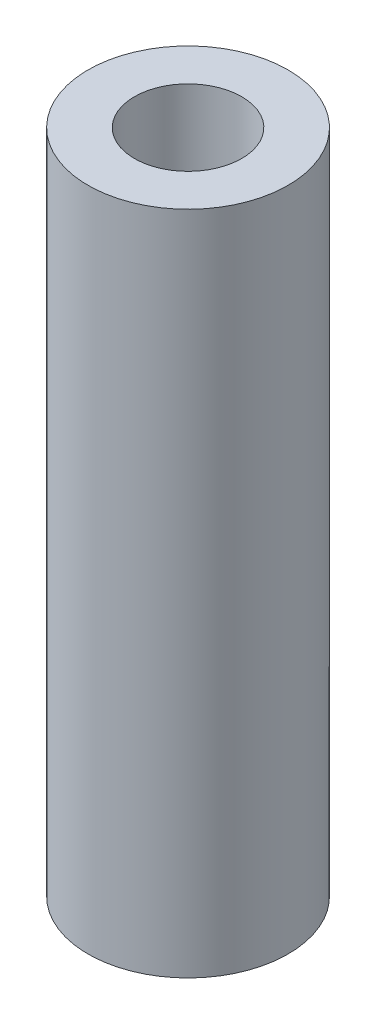
ISO-10303-21;
HEADER;
FILE_DESCRIPTION(('STEP AP214'),'2;1');
FILE_NAME('part.step','',(''),(''),'','','');
FILE_SCHEMA(('AUTOMOTIVE_DESIGN { 1 0 10303 214 1 1 1 1 }'));
ENDSEC;
DATA;
#1=APPLICATION_CONTEXT('core data for automotive mechanical design processes');
#2=APPLICATION_PROTOCOL_DEFINITION('international standard','automotive_design',2000,#1);
#3=PRODUCT_CONTEXT('',#1,'mechanical');
#4=PRODUCT('Part','Part','',(#3));
#5=PRODUCT_RELATED_PRODUCT_CATEGORY('part','',(#4));
#6=PRODUCT_DEFINITION_FORMATION('','',#4);
#7=PRODUCT_DEFINITION_CONTEXT('part definition',#1,'design');
#8=PRODUCT_DEFINITION('design','',#6,#7);
#9=PRODUCT_DEFINITION_SHAPE('','',#8);
#10=(LENGTH_UNIT() NAMED_UNIT(*) SI_UNIT(.MILLI.,.METRE.));
#11=(NAMED_UNIT(*) PLANE_ANGLE_UNIT() SI_UNIT($,.RADIAN.));
#12=(NAMED_UNIT(*) SI_UNIT($,.STERADIAN.) SOLID_ANGLE_UNIT());
#13=UNCERTAINTY_MEASURE_WITH_UNIT(LENGTH_MEASURE(1.E-05),#10,'distance_accuracy_value','');
#14=(GEOMETRIC_REPRESENTATION_CONTEXT(3) GLOBAL_UNCERTAINTY_ASSIGNED_CONTEXT((#13)) GLOBAL_UNIT_ASSIGNED_CONTEXT((#10,
#11,#12)) REPRESENTATION_CONTEXT('',''));
#15=CARTESIAN_POINT('',(0.,0.,0.));
#16=DIRECTION('',(0.,0.,1.));
#17=DIRECTION('',(1.,0.,0.));
#18=AXIS2_PLACEMENT_3D('',#15,#16,#17);
#19=CARTESIAN_POINT('',(0.,31.6992,0.));
#20=DIRECTION('',(0.,1.,0.));
#21=DIRECTION('',(0.,0.,-1.));
#22=AXIS2_PLACEMENT_3D('',#19,#20,#21);
#23=PLANE('',#22);
#24=CARTESIAN_POINT('',(0.,31.6992,0.));
#25=DIRECTION('',(0.,-1.,0.));
#26=DIRECTION('',(0.,0.,-1.));
#27=AXIS2_PLACEMENT_3D('',#24,#25,#26);
#28=CIRCLE('',#27,4.7625);
#29=CARTESIAN_POINT('',(0.,31.6992,-4.7625));
#30=VERTEX_POINT('',#29);
#31=EDGE_CURVE('E10',#30,#30,#28,.T.);
#32=ORIENTED_EDGE('',*,*,#31,.F.);
#33=EDGE_LOOP('',(#32));
#34=FACE_BOUND('',#33,.T.);
#35=CARTESIAN_POINT('',(0.,31.6992,0.));
#36=DIRECTION('',(0.,-1.,0.));
#37=DIRECTION('',(0.,0.,-1.));
#38=AXIS2_PLACEMENT_3D('',#35,#36,#37);
#39=CIRCLE('',#38,2.5527);
#40=CARTESIAN_POINT('',(0.,31.6992,-2.5527));
#41=VERTEX_POINT('',#40);
#42=EDGE_CURVE('E41',#41,#41,#39,.T.);
#43=ORIENTED_EDGE('',*,*,#42,.T.);
#44=EDGE_LOOP('',(#43));
#45=FACE_BOUND('',#44,.T.);
#46=ADVANCED_FACE('F30',(#34,#45),#23,.T.);
#47=CARTESIAN_POINT('',(0.,0.,0.));
#48=DIRECTION('',(0.,1.,0.));
#49=DIRECTION('',(0.,0.,-1.));
#50=AXIS2_PLACEMENT_3D('',#47,#48,#49);
#51=PLANE('',#50);
#52=CARTESIAN_POINT('',(0.,0.,0.));
#53=DIRECTION('',(0.,-1.,0.));
#54=DIRECTION('',(0.,0.,-1.));
#55=AXIS2_PLACEMENT_3D('',#52,#53,#54);
#56=CIRCLE('',#55,4.7625);
#57=CARTESIAN_POINT('',(0.,0.,-4.7625));
#58=VERTEX_POINT('',#57);
#59=EDGE_CURVE('E34',#58,#58,#56,.T.);
#60=ORIENTED_EDGE('',*,*,#59,.T.);
#61=EDGE_LOOP('',(#60));
#62=FACE_BOUND('',#61,.T.);
#63=CARTESIAN_POINT('',(0.,0.,0.));
#64=DIRECTION('',(0.,-1.,0.));
#65=DIRECTION('',(0.,0.,-1.));
#66=AXIS2_PLACEMENT_3D('',#63,#64,#65);
#67=CIRCLE('',#66,2.5527);
#68=CARTESIAN_POINT('',(0.,0.,-2.5527));
#69=VERTEX_POINT('',#68);
#70=EDGE_CURVE('E43',#69,#69,#67,.T.);
#71=ORIENTED_EDGE('',*,*,#70,.F.);
#72=EDGE_LOOP('',(#71));
#73=FACE_BOUND('',#72,.T.);
#74=ADVANCED_FACE('F56',(#62,#73),#51,.F.);
#75=CARTESIAN_POINT('',(0.,31.6992,0.));
#76=DIRECTION('',(0.,-1.,0.));
#77=DIRECTION('',(0.,0.,1.));
#78=AXIS2_PLACEMENT_3D('',#75,#76,#77);
#79=CYLINDRICAL_SURFACE('',#78,4.7625);
#80=ORIENTED_EDGE('',*,*,#31,.T.);
#81=EDGE_LOOP('',(#80));
#82=FACE_BOUND('',#81,.T.);
#83=ORIENTED_EDGE('',*,*,#59,.F.);
#84=EDGE_LOOP('',(#83));
#85=FACE_BOUND('',#84,.T.);
#86=ADVANCED_FACE('F32',(#82,#85),#79,.T.);
#87=CARTESIAN_POINT('',(0.,31.6992,0.));
#88=DIRECTION('',(0.,-1.,0.));
#89=DIRECTION('',(0.,0.,1.));
#90=AXIS2_PLACEMENT_3D('',#87,#88,#89);
#91=CYLINDRICAL_SURFACE('',#90,2.5527);
#92=ORIENTED_EDGE('',*,*,#42,.F.);
#93=EDGE_LOOP('',(#92));
#94=FACE_BOUND('',#93,.T.);
#95=ORIENTED_EDGE('',*,*,#70,.T.);
#96=EDGE_LOOP('',(#95));
#97=FACE_BOUND('',#96,.T.);
#98=ADVANCED_FACE('F50',(#94,#97),#91,.F.);
#99=CLOSED_SHELL('',(#46,#74,#86,#98));
#100=MANIFOLD_SOLID_BREP('B2',#99);
#101=ADVANCED_BREP_SHAPE_REPRESENTATION('',(#18,#100),#14);
#102=SHAPE_DEFINITION_REPRESENTATION(#9,#101);
ENDSEC;
END-ISO-10303-21;
